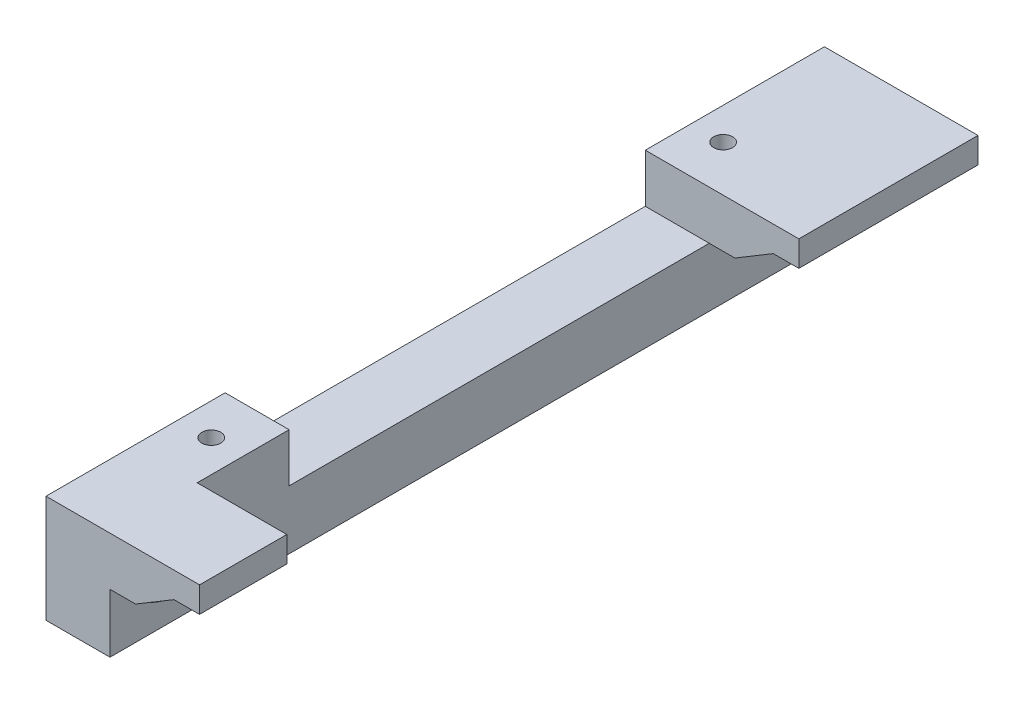
ISO-10303-21;
HEADER;
FILE_DESCRIPTION(('STEP AP214'),'2;1');
FILE_NAME('part.step','',(''),(''),'','','');
FILE_SCHEMA(('AUTOMOTIVE_DESIGN { 1 0 10303 214 1 1 1 1 }'));
ENDSEC;
DATA;
#1=APPLICATION_CONTEXT('core data for automotive mechanical design processes');
#2=APPLICATION_PROTOCOL_DEFINITION('international standard','automotive_design',2000,#1);
#3=PRODUCT_CONTEXT('',#1,'mechanical');
#4=PRODUCT('Part','Part','',(#3));
#5=PRODUCT_RELATED_PRODUCT_CATEGORY('part','',(#4));
#6=PRODUCT_DEFINITION_FORMATION('','',#4);
#7=PRODUCT_DEFINITION_CONTEXT('part definition',#1,'design');
#8=PRODUCT_DEFINITION('design','',#6,#7);
#9=PRODUCT_DEFINITION_SHAPE('','',#8);
#10=(LENGTH_UNIT() NAMED_UNIT(*) SI_UNIT(.MILLI.,.METRE.));
#11=(NAMED_UNIT(*) PLANE_ANGLE_UNIT() SI_UNIT($,.RADIAN.));
#12=(NAMED_UNIT(*) SI_UNIT($,.STERADIAN.) SOLID_ANGLE_UNIT());
#13=UNCERTAINTY_MEASURE_WITH_UNIT(LENGTH_MEASURE(1.E-05),#10,'distance_accuracy_value','');
#14=(GEOMETRIC_REPRESENTATION_CONTEXT(3) GLOBAL_UNCERTAINTY_ASSIGNED_CONTEXT((#13)) GLOBAL_UNIT_ASSIGNED_CONTEXT((#10,
#11,#12)) REPRESENTATION_CONTEXT('',''));
#15=CARTESIAN_POINT('',(0.,0.,0.));
#16=DIRECTION('',(0.,0.,1.));
#17=DIRECTION('',(1.,0.,0.));
#18=AXIS2_PLACEMENT_3D('',#15,#16,#17);
#19=CARTESIAN_POINT('',(21.37,31.,104.035));
#20=DIRECTION('',(0.,0.,1.));
#21=DIRECTION('',(-1.,0.,0.));
#22=AXIS2_PLACEMENT_3D('',#19,#20,#21);
#23=PLANE('',#22);
#24=DIRECTION('',(0.,-1.,0.));
#25=VECTOR('',#24,1.);
#26=CARTESIAN_POINT('',(3.86999999999998,31.,104.035));
#27=LINE('',#26,#25);
#28=CARTESIAN_POINT('',(3.86999999999998,31.,104.035));
#29=VERTEX_POINT('',#28);
#30=CARTESIAN_POINT('',(3.86999999999998,21.5,104.035));
#31=VERTEX_POINT('',#30);
#32=EDGE_CURVE('E183',#29,#31,#27,.T.);
#33=ORIENTED_EDGE('',*,*,#32,.T.);
#34=DIRECTION('',(-1.,0.,0.));
#35=VECTOR('',#34,1.);
#36=CARTESIAN_POINT('',(21.37,21.5,104.035));
#37=LINE('',#36,#35);
#38=CARTESIAN_POINT('',(-8.63000000000001,21.5,104.035));
#39=VERTEX_POINT('',#38);
#40=EDGE_CURVE('E192',#31,#39,#37,.T.);
#41=ORIENTED_EDGE('',*,*,#40,.T.);
#42=DIRECTION('',(0.,-1.,0.));
#43=VECTOR('',#42,1.);
#44=CARTESIAN_POINT('',(-8.63000000000001,31.,104.035));
#45=LINE('',#44,#43);
#46=CARTESIAN_POINT('',(-8.63000000000001,31.,104.035));
#47=VERTEX_POINT('',#46);
#48=EDGE_CURVE('E218',#47,#39,#45,.T.);
#49=ORIENTED_EDGE('',*,*,#48,.F.);
#50=DIRECTION('',(-1.,0.,0.));
#51=VECTOR('',#50,1.);
#52=CARTESIAN_POINT('',(21.37,31.,104.035));
#53=LINE('',#52,#51);
#54=EDGE_CURVE('E202',#29,#47,#53,.T.);
#55=ORIENTED_EDGE('',*,*,#54,.F.);
#56=EDGE_LOOP('',(#33,#41,#49,#55));
#57=FACE_BOUND('',#56,.T.);
#58=ADVANCED_FACE('F47',(#57),#23,.F.);
#59=CARTESIAN_POINT('',(21.37,10.,-13.055));
#60=DIRECTION('',(1.,0.,0.));
#61=DIRECTION('',(0.,0.,1.));
#62=AXIS2_PLACEMENT_3D('',#59,#60,#61);
#63=PLANE('',#62);
#64=DIRECTION('',(0.,1.,0.));
#65=VECTOR('',#64,1.);
#66=CARTESIAN_POINT('',(21.37,31.,121.995));
#67=LINE('',#66,#65);
#68=CARTESIAN_POINT('',(21.37,26.,121.995));
#69=VERTEX_POINT('',#68);
#70=CARTESIAN_POINT('',(21.37,31.,121.995));
#71=VERTEX_POINT('',#70);
#72=EDGE_CURVE('E204',#69,#71,#67,.T.);
#73=ORIENTED_EDGE('',*,*,#72,.T.);
#74=DIRECTION('',(0.,0.,1.));
#75=VECTOR('',#74,1.);
#76=CARTESIAN_POINT('',(21.37,31.,-13.055));
#77=LINE('',#76,#75);
#78=CARTESIAN_POINT('',(21.37,31.,139.035));
#79=VERTEX_POINT('',#78);
#80=EDGE_CURVE('E316',#71,#79,#77,.T.);
#81=ORIENTED_EDGE('',*,*,#80,.T.);
#82=DIRECTION('',(0.,-1.,0.));
#83=VECTOR('',#82,1.);
#84=CARTESIAN_POINT('',(21.37,10.,139.035));
#85=LINE('',#84,#83);
#86=CARTESIAN_POINT('',(21.37,26.,139.035));
#87=VERTEX_POINT('',#86);
#88=EDGE_CURVE('E287',#79,#87,#85,.T.);
#89=ORIENTED_EDGE('',*,*,#88,.T.);
#90=DIRECTION('',(0.,0.,1.));
#91=VECTOR('',#90,1.);
#92=CARTESIAN_POINT('',(21.37,26.,-36.7668114027588));
#93=LINE('',#92,#91);
#94=EDGE_CURVE('E271',#69,#87,#93,.T.);
#95=ORIENTED_EDGE('',*,*,#94,.F.);
#96=EDGE_LOOP('',(#73,#81,#89,#95));
#97=FACE_BOUND('',#96,.T.);
#98=ADVANCED_FACE('F339',(#97),#63,.T.);
#99=CARTESIAN_POINT('',(21.37,31.,-13.055));
#100=DIRECTION('',(0.,1.,0.));
#101=DIRECTION('',(0.,0.,1.));
#102=AXIS2_PLACEMENT_3D('',#99,#100,#101);
#103=PLANE('',#102);
#104=DIRECTION('',(1.,0.,0.));
#105=VECTOR('',#104,1.);
#106=CARTESIAN_POINT('',(3.86999999999998,31.,121.995));
#107=LINE('',#106,#105);
#108=CARTESIAN_POINT('',(3.86999999999998,31.,121.995));
#109=VERTEX_POINT('',#108);
#110=EDGE_CURVE('E212',#109,#71,#107,.T.);
#111=ORIENTED_EDGE('',*,*,#110,.F.);
#112=DIRECTION('',(0.,0.,-1.));
#113=VECTOR('',#112,1.);
#114=CARTESIAN_POINT('',(3.86999999999998,31.,104.035));
#115=LINE('',#114,#113);
#116=EDGE_CURVE('E62',#109,#29,#115,.T.);
#117=ORIENTED_EDGE('',*,*,#116,.T.);
#118=ORIENTED_EDGE('',*,*,#54,.T.);
#119=DIRECTION('',(0.,0.,1.));
#120=VECTOR('',#119,1.);
#121=CARTESIAN_POINT('',(-8.63000000000001,31.,-13.055));
#122=LINE('',#121,#120);
#123=CARTESIAN_POINT('',(-8.63000000000001,31.,139.035));
#124=VERTEX_POINT('',#123);
#125=EDGE_CURVE('E320',#47,#124,#122,.T.);
#126=ORIENTED_EDGE('',*,*,#125,.T.);
#127=DIRECTION('',(1.,0.,0.));
#128=VECTOR('',#127,1.);
#129=CARTESIAN_POINT('',(21.37,31.,139.035));
#130=LINE('',#129,#128);
#131=EDGE_CURVE('E299',#124,#79,#130,.T.);
#132=ORIENTED_EDGE('',*,*,#131,.T.);
#133=ORIENTED_EDGE('',*,*,#80,.F.);
#134=EDGE_LOOP('',(#111,#117,#118,#126,#132,#133));
#135=FACE_BOUND('',#134,.T.);
#136=CARTESIAN_POINT('',(-2.38,31.,112.99));
#137=DIRECTION('',(0.,-1.,0.));
#138=DIRECTION('',(0.,0.,1.));
#139=AXIS2_PLACEMENT_3D('',#136,#137,#138);
#140=CIRCLE('',#139,1.85);
#141=CARTESIAN_POINT('',(-2.38,31.,114.84));
#142=VERTEX_POINT('',#141);
#143=EDGE_CURVE('E236',#142,#142,#140,.T.);
#144=ORIENTED_EDGE('',*,*,#143,.T.);
#145=EDGE_LOOP('',(#144));
#146=FACE_BOUND('',#145,.T.);
#147=ADVANCED_FACE('F326',(#135,#146),#103,.T.);
#148=CARTESIAN_POINT('',(3.86999999999998,21.5,-36.7668114027588));
#149=DIRECTION('',(0.,1.,0.));
#150=DIRECTION('',(1.,0.,0.));
#151=AXIS2_PLACEMENT_3D('',#148,#149,#150);
#152=PLANE('',#151);
#153=DIRECTION('',(0.,0.,1.));
#154=VECTOR('',#153,1.);
#155=CARTESIAN_POINT('',(8.86999999999999,21.5,-36.7668114027588));
#156=LINE('',#155,#154);
#157=CARTESIAN_POINT('',(8.86999999999999,21.5,121.995));
#158=VERTEX_POINT('',#157);
#159=CARTESIAN_POINT('',(8.86999999999999,21.5,139.035));
#160=VERTEX_POINT('',#159);
#161=EDGE_CURVE('E281',#158,#160,#156,.T.);
#162=ORIENTED_EDGE('',*,*,#161,.T.);
#163=DIRECTION('',(1.,0.,0.));
#164=VECTOR('',#163,1.);
#165=CARTESIAN_POINT('',(3.86999999999998,21.5,139.035));
#166=LINE('',#165,#164);
#167=CARTESIAN_POINT('',(3.86999999999998,21.5,139.035));
#168=VERTEX_POINT('',#167);
#169=EDGE_CURVE('E265',#168,#160,#166,.T.);
#170=ORIENTED_EDGE('',*,*,#169,.F.);
#171=DIRECTION('',(0.,0.,1.));
#172=VECTOR('',#171,1.);
#173=CARTESIAN_POINT('',(3.86999999999998,21.5,-36.7668114027588));
#174=LINE('',#173,#172);
#175=CARTESIAN_POINT('',(3.86999999999998,21.5,121.995));
#176=VERTEX_POINT('',#175);
#177=EDGE_CURVE('E284',#176,#168,#174,.T.);
#178=ORIENTED_EDGE('',*,*,#177,.F.);
#179=DIRECTION('',(1.,0.,0.));
#180=VECTOR('',#179,1.);
#181=CARTESIAN_POINT('',(3.86999999999998,21.5,121.995));
#182=LINE('',#181,#180);
#183=EDGE_CURVE('E210',#176,#158,#182,.T.);
#184=ORIENTED_EDGE('',*,*,#183,.T.);
#185=EDGE_LOOP('',(#162,#170,#178,#184));
#186=FACE_BOUND('',#185,.T.);
#187=ADVANCED_FACE('F350',(#186),#152,.F.);
#188=CARTESIAN_POINT('',(8.86999999999999,21.5,-36.7668114027588));
#189=DIRECTION('',(-0.514495755427527,0.857492925712544,0.));
#190=DIRECTION('',(0.857492925712544,0.514495755427527,0.));
#191=AXIS2_PLACEMENT_3D('',#188,#189,#190);
#192=PLANE('',#191);
#193=DIRECTION('',(0.,0.,1.));
#194=VECTOR('',#193,1.);
#195=CARTESIAN_POINT('',(16.37,26.,-36.7668114027588));
#196=LINE('',#195,#194);
#197=CARTESIAN_POINT('',(16.37,26.,121.995));
#198=VERTEX_POINT('',#197);
#199=CARTESIAN_POINT('',(16.37,26.,139.035));
#200=VERTEX_POINT('',#199);
#201=EDGE_CURVE('E276',#198,#200,#196,.T.);
#202=ORIENTED_EDGE('',*,*,#201,.T.);
#203=DIRECTION('',(0.857492925712544,0.514495755427527,0.));
#204=VECTOR('',#203,1.);
#205=CARTESIAN_POINT('',(8.86999999999999,21.5,139.035));
#206=LINE('',#205,#204);
#207=EDGE_CURVE('E262',#160,#200,#206,.T.);
#208=ORIENTED_EDGE('',*,*,#207,.F.);
#209=ORIENTED_EDGE('',*,*,#161,.F.);
#210=DIRECTION('',(-0.857492925712544,-0.514495755427527,0.));
#211=VECTOR('',#210,1.);
#212=CARTESIAN_POINT('',(8.86999999999999,21.5,121.995));
#213=LINE('',#212,#211);
#214=EDGE_CURVE('E214',#198,#158,#213,.T.);
#215=ORIENTED_EDGE('',*,*,#214,.F.);
#216=EDGE_LOOP('',(#202,#208,#209,#215));
#217=FACE_BOUND('',#216,.T.);
#218=ADVANCED_FACE('F382',(#217),#192,.F.);
#219=CARTESIAN_POINT('',(16.37,26.,-36.7668114027588));
#220=DIRECTION('',(0.,1.,0.));
#221=DIRECTION('',(0.,0.,1.));
#222=AXIS2_PLACEMENT_3D('',#219,#220,#221);
#223=PLANE('',#222);
#224=ORIENTED_EDGE('',*,*,#94,.T.);
#225=DIRECTION('',(1.,0.,0.));
#226=VECTOR('',#225,1.);
#227=CARTESIAN_POINT('',(16.37,26.,139.035));
#228=LINE('',#227,#226);
#229=EDGE_CURVE('E259',#200,#87,#228,.T.);
#230=ORIENTED_EDGE('',*,*,#229,.F.);
#231=ORIENTED_EDGE('',*,*,#201,.F.);
#232=DIRECTION('',(-1.,0.,0.));
#233=VECTOR('',#232,1.);
#234=CARTESIAN_POINT('',(16.37,26.,121.995));
#235=LINE('',#234,#233);
#236=EDGE_CURVE('E12',#69,#198,#235,.T.);
#237=ORIENTED_EDGE('',*,*,#236,.F.);
#238=EDGE_LOOP('',(#224,#230,#231,#237));
#239=FACE_BOUND('',#238,.T.);
#240=ADVANCED_FACE('F389',(#239),#223,.F.);
#241=CARTESIAN_POINT('',(3.86999999999999,10.,-36.7668114027588));
#242=DIRECTION('',(-1.,0.,0.));
#243=DIRECTION('',(0.,1.,0.));
#244=AXIS2_PLACEMENT_3D('',#241,#242,#243);
#245=PLANE('',#244);
#246=DIRECTION('',(0.,0.,1.));
#247=VECTOR('',#246,1.);
#248=CARTESIAN_POINT('',(3.86999999999999,10.,-36.7668114027588));
#249=LINE('',#248,#247);
#250=CARTESIAN_POINT('',(3.86999999999999,10.,-13.055));
#251=VERTEX_POINT('',#250);
#252=CARTESIAN_POINT('',(3.86999999999999,10.,139.035));
#253=VERTEX_POINT('',#252);
#254=EDGE_CURVE('E261',#251,#253,#249,.T.);
#255=ORIENTED_EDGE('',*,*,#254,.F.);
#256=DIRECTION('',(0.,1.,0.));
#257=VECTOR('',#256,1.);
#258=CARTESIAN_POINT('',(3.86999999999999,10.,-13.055));
#259=LINE('',#258,#257);
#260=CARTESIAN_POINT('',(3.86999999999998,21.5,-13.055));
#261=VERTEX_POINT('',#260);
#262=EDGE_CURVE('E282',#251,#261,#259,.T.);
#263=ORIENTED_EDGE('',*,*,#262,.T.);
#264=CARTESIAN_POINT('',(3.86999999999998,21.5,21.945));
#265=VERTEX_POINT('',#264);
#266=EDGE_CURVE('E186',#261,#265,#174,.T.);
#267=ORIENTED_EDGE('',*,*,#266,.T.);
#268=DIRECTION('',(0.,0.,-1.));
#269=VECTOR('',#268,1.);
#270=CARTESIAN_POINT('',(3.86999999999998,21.5,-36.7668114027588));
#271=LINE('',#270,#269);
#272=EDGE_CURVE('E177',#31,#265,#271,.T.);
#273=ORIENTED_EDGE('',*,*,#272,.F.);
#274=ORIENTED_EDGE('',*,*,#32,.F.);
#275=ORIENTED_EDGE('',*,*,#116,.F.);
#276=DIRECTION('',(0.,1.,0.));
#277=VECTOR('',#276,1.);
#278=CARTESIAN_POINT('',(3.86999999999998,31.,121.995));
#279=LINE('',#278,#277);
#280=EDGE_CURVE('E203',#176,#109,#279,.T.);
#281=ORIENTED_EDGE('',*,*,#280,.F.);
#282=ORIENTED_EDGE('',*,*,#177,.T.);
#283=DIRECTION('',(0.,1.,0.));
#284=VECTOR('',#283,1.);
#285=CARTESIAN_POINT('',(3.86999999999999,10.,139.035));
#286=LINE('',#285,#284);
#287=EDGE_CURVE('E256',#253,#168,#286,.T.);
#288=ORIENTED_EDGE('',*,*,#287,.F.);
#289=EDGE_LOOP('',(#255,#263,#267,#273,#274,#275,#281,#282,#288));
#290=FACE_BOUND('',#289,.T.);
#291=DIRECTION('',(0.,0.,1.));
#292=VECTOR('',#291,1.);
#293=CARTESIAN_POINT('',(3.86999999999999,15.5,7.817281323269));
#294=LINE('',#293,#292);
#295=CARTESIAN_POINT('',(3.86999999999999,15.5,2.07271867673098));
#296=VERTEX_POINT('',#295);
#297=CARTESIAN_POINT('',(3.86999999999999,15.5,7.817281323269));
#298=VERTEX_POINT('',#297);
#299=EDGE_CURVE('E245',#296,#298,#294,.T.);
#300=ORIENTED_EDGE('',*,*,#299,.T.);
#301=DIRECTION('',(0.,1.,0.));
#302=VECTOR('',#301,1.);
#303=CARTESIAN_POINT('',(3.86999999999999,15.5,7.817281323269));
#304=LINE('',#303,#302);
#305=CARTESIAN_POINT('',(3.86999999999998,19.,7.81728132326899));
#306=VERTEX_POINT('',#305);
#307=EDGE_CURVE('E253',#298,#306,#304,.T.);
#308=ORIENTED_EDGE('',*,*,#307,.T.);
#309=DIRECTION('',(0.,0.,1.));
#310=VECTOR('',#309,1.);
#311=CARTESIAN_POINT('',(3.86999999999999,19.,7.817281323269));
#312=LINE('',#311,#310);
#313=CARTESIAN_POINT('',(3.86999999999999,19.,2.07271867673098));
#314=VERTEX_POINT('',#313);
#315=EDGE_CURVE('E246',#314,#306,#312,.T.);
#316=ORIENTED_EDGE('',*,*,#315,.F.);
#317=DIRECTION('',(0.,1.,0.));
#318=VECTOR('',#317,1.);
#319=CARTESIAN_POINT('',(3.86999999999999,15.5,2.07271867673098));
#320=LINE('',#319,#318);
#321=EDGE_CURVE('E249',#296,#314,#320,.T.);
#322=ORIENTED_EDGE('',*,*,#321,.F.);
#323=EDGE_LOOP('',(#300,#308,#316,#322));
#324=FACE_BOUND('',#323,.T.);
#325=ADVANCED_FACE('F180',(#290,#324),#245,.F.);
#326=DIRECTION('',(0.,1.,0.));
#327=VECTOR('',#326,1.);
#328=CARTESIAN_POINT('',(21.37,31.,21.945));
#329=LINE('',#328,#327);
#330=CARTESIAN_POINT('',(21.37,26.,21.945));
#331=VERTEX_POINT('',#330);
#332=CARTESIAN_POINT('',(21.37,31.,21.945));
#333=VERTEX_POINT('',#332);
#334=EDGE_CURVE('E200',#331,#333,#329,.T.);
#335=ORIENTED_EDGE('',*,*,#334,.F.);
#336=CARTESIAN_POINT('',(21.37,26.,-13.055));
#337=VERTEX_POINT('',#336);
#338=EDGE_CURVE('E285',#337,#331,#93,.T.);
#339=ORIENTED_EDGE('',*,*,#338,.F.);
#340=DIRECTION('',(0.,-1.,0.));
#341=VECTOR('',#340,1.);
#342=CARTESIAN_POINT('',(21.37,10.,-13.055));
#343=LINE('',#342,#341);
#344=CARTESIAN_POINT('',(21.37,31.,-13.055));
#345=VERTEX_POINT('',#344);
#346=EDGE_CURVE('E295',#345,#337,#343,.T.);
#347=ORIENTED_EDGE('',*,*,#346,.F.);
#348=EDGE_CURVE('E313',#345,#333,#77,.T.);
#349=ORIENTED_EDGE('',*,*,#348,.T.);
#350=EDGE_LOOP('',(#335,#339,#347,#349));
#351=FACE_BOUND('',#350,.T.);
#352=ADVANCED_FACE('F49',(#351),#63,.T.);
#353=DIRECTION('',(-1.,0.,0.));
#354=VECTOR('',#353,1.);
#355=CARTESIAN_POINT('',(21.37,31.,21.945));
#356=LINE('',#355,#354);
#357=CARTESIAN_POINT('',(-8.63000000000001,31.,21.945));
#358=VERTEX_POINT('',#357);
#359=EDGE_CURVE('E225',#333,#358,#356,.T.);
#360=ORIENTED_EDGE('',*,*,#359,.F.);
#361=ORIENTED_EDGE('',*,*,#348,.F.);
#362=DIRECTION('',(1.,0.,0.));
#363=VECTOR('',#362,1.);
#364=CARTESIAN_POINT('',(21.37,31.,-13.055));
#365=LINE('',#364,#363);
#366=CARTESIAN_POINT('',(-8.63000000000001,31.,-13.055));
#367=VERTEX_POINT('',#366);
#368=EDGE_CURVE('E303',#367,#345,#365,.T.);
#369=ORIENTED_EDGE('',*,*,#368,.F.);
#370=EDGE_CURVE('E317',#367,#358,#122,.T.);
#371=ORIENTED_EDGE('',*,*,#370,.T.);
#372=EDGE_LOOP('',(#360,#361,#369,#371));
#373=FACE_BOUND('',#372,.T.);
#374=CARTESIAN_POINT('',(-2.38,31.,12.99));
#375=DIRECTION('',(0.,-1.,0.));
#376=DIRECTION('',(0.,0.,1.));
#377=AXIS2_PLACEMENT_3D('',#374,#375,#376);
#378=CIRCLE('',#377,1.85);
#379=CARTESIAN_POINT('',(-2.38,31.,14.84));
#380=VERTEX_POINT('',#379);
#381=EDGE_CURVE('E188',#380,#380,#378,.T.);
#382=ORIENTED_EDGE('',*,*,#381,.T.);
#383=EDGE_LOOP('',(#382));
#384=FACE_BOUND('',#383,.T.);
#385=ADVANCED_FACE('F369',(#373,#384),#103,.T.);
#386=CARTESIAN_POINT('',(-8.63000000000001,10.,-13.055));
#387=DIRECTION('',(-1.,0.,0.));
#388=DIRECTION('',(0.,0.,-1.));
#389=AXIS2_PLACEMENT_3D('',#386,#387,#388);
#390=PLANE('',#389);
#391=ORIENTED_EDGE('',*,*,#48,.T.);
#392=DIRECTION('',(0.,0.,-1.));
#393=VECTOR('',#392,1.);
#394=CARTESIAN_POINT('',(-8.63000000000001,21.5,104.035));
#395=LINE('',#394,#393);
#396=CARTESIAN_POINT('',(-8.63000000000001,21.5,21.945));
#397=VERTEX_POINT('',#396);
#398=EDGE_CURVE('E195',#39,#397,#395,.T.);
#399=ORIENTED_EDGE('',*,*,#398,.T.);
#400=DIRECTION('',(0.,1.,0.));
#401=VECTOR('',#400,1.);
#402=CARTESIAN_POINT('',(-8.63000000000001,31.,21.945));
#403=LINE('',#402,#401);
#404=EDGE_CURVE('E220',#397,#358,#403,.T.);
#405=ORIENTED_EDGE('',*,*,#404,.T.);
#406=ORIENTED_EDGE('',*,*,#370,.F.);
#407=DIRECTION('',(0.,1.,0.));
#408=VECTOR('',#407,1.);
#409=CARTESIAN_POINT('',(-8.63000000000001,10.,-13.055));
#410=LINE('',#409,#408);
#411=CARTESIAN_POINT('',(-8.63000000000001,10.,-13.055));
#412=VERTEX_POINT('',#411);
#413=EDGE_CURVE('E301',#412,#367,#410,.T.);
#414=ORIENTED_EDGE('',*,*,#413,.F.);
#415=DIRECTION('',(0.,0.,1.));
#416=VECTOR('',#415,1.);
#417=CARTESIAN_POINT('',(-8.63000000000001,10.,-13.055));
#418=LINE('',#417,#416);
#419=CARTESIAN_POINT('',(-8.63000000000001,10.,139.035));
#420=VERTEX_POINT('',#419);
#421=EDGE_CURVE('E305',#412,#420,#418,.T.);
#422=ORIENTED_EDGE('',*,*,#421,.T.);
#423=DIRECTION('',(0.,1.,0.));
#424=VECTOR('',#423,1.);
#425=CARTESIAN_POINT('',(-8.63000000000001,10.,139.035));
#426=LINE('',#425,#424);
#427=EDGE_CURVE('E310',#420,#124,#426,.T.);
#428=ORIENTED_EDGE('',*,*,#427,.T.);
#429=ORIENTED_EDGE('',*,*,#125,.F.);
#430=EDGE_LOOP('',(#391,#399,#405,#406,#414,#422,#428,#429));
#431=FACE_BOUND('',#430,.T.);
#432=ADVANCED_FACE('F331',(#431),#390,.T.);
#433=CARTESIAN_POINT('',(21.37,10.,-13.055));
#434=DIRECTION('',(0.,-1.,0.));
#435=DIRECTION('',(0.,0.,-1.));
#436=AXIS2_PLACEMENT_3D('',#433,#434,#435);
#437=PLANE('',#436);
#438=CARTESIAN_POINT('',(-2.38,10.,12.99));
#439=DIRECTION('',(0.,1.,0.));
#440=DIRECTION('',(0.,0.,-1.));
#441=AXIS2_PLACEMENT_3D('',#438,#439,#440);
#442=CIRCLE('',#441,1.85);
#443=CARTESIAN_POINT('',(-2.38,10.,11.14));
#444=VERTEX_POINT('',#443);
#445=EDGE_CURVE('E233',#444,#444,#442,.T.);
#446=ORIENTED_EDGE('',*,*,#445,.T.);
#447=EDGE_LOOP('',(#446));
#448=FACE_BOUND('',#447,.T.);
#449=CARTESIAN_POINT('',(-2.38,10.,112.99));
#450=DIRECTION('',(0.,1.,0.));
#451=DIRECTION('',(0.,0.,-1.));
#452=AXIS2_PLACEMENT_3D('',#449,#450,#451);
#453=CIRCLE('',#452,1.85);
#454=CARTESIAN_POINT('',(-2.38,10.,111.14));
#455=VERTEX_POINT('',#454);
#456=EDGE_CURVE('E239',#455,#455,#453,.T.);
#457=ORIENTED_EDGE('',*,*,#456,.T.);
#458=EDGE_LOOP('',(#457));
#459=FACE_BOUND('',#458,.T.);
#460=ORIENTED_EDGE('',*,*,#254,.T.);
#461=DIRECTION('',(-1.,0.,0.));
#462=VECTOR('',#461,1.);
#463=CARTESIAN_POINT('',(21.37,10.,139.035));
#464=LINE('',#463,#462);
#465=EDGE_CURVE('E308',#253,#420,#464,.T.);
#466=ORIENTED_EDGE('',*,*,#465,.T.);
#467=ORIENTED_EDGE('',*,*,#421,.F.);
#468=DIRECTION('',(-1.,0.,0.));
#469=VECTOR('',#468,1.);
#470=CARTESIAN_POINT('',(21.37,10.,-13.055));
#471=LINE('',#470,#469);
#472=EDGE_CURVE('E298',#251,#412,#471,.T.);
#473=ORIENTED_EDGE('',*,*,#472,.F.);
#474=EDGE_LOOP('',(#460,#466,#467,#473));
#475=FACE_BOUND('',#474,.T.);
#476=ADVANCED_FACE('F354',(#448,#459,#475),#437,.T.);
#477=CARTESIAN_POINT('',(-17.26,0.,-13.055));
#478=DIRECTION('',(0.,0.,-1.));
#479=DIRECTION('',(1.,0.,0.));
#480=AXIS2_PLACEMENT_3D('',#477,#478,#479);
#481=PLANE('',#480);
#482=ORIENTED_EDGE('',*,*,#262,.F.);
#483=ORIENTED_EDGE('',*,*,#472,.T.);
#484=ORIENTED_EDGE('',*,*,#413,.T.);
#485=ORIENTED_EDGE('',*,*,#368,.T.);
#486=ORIENTED_EDGE('',*,*,#346,.T.);
#487=DIRECTION('',(1.,0.,0.));
#488=VECTOR('',#487,1.);
#489=CARTESIAN_POINT('',(16.37,26.,-13.055));
#490=LINE('',#489,#488);
#491=CARTESIAN_POINT('',(16.37,26.,-13.055));
#492=VERTEX_POINT('',#491);
#493=EDGE_CURVE('E269',#492,#337,#490,.T.);
#494=ORIENTED_EDGE('',*,*,#493,.F.);
#495=DIRECTION('',(0.857492925712544,0.514495755427527,0.));
#496=VECTOR('',#495,1.);
#497=CARTESIAN_POINT('',(8.86999999999999,21.5,-13.055));
#498=LINE('',#497,#496);
#499=CARTESIAN_POINT('',(8.86999999999999,21.5,-13.055));
#500=VERTEX_POINT('',#499);
#501=EDGE_CURVE('E273',#500,#492,#498,.T.);
#502=ORIENTED_EDGE('',*,*,#501,.F.);
#503=DIRECTION('',(1.,0.,0.));
#504=VECTOR('',#503,1.);
#505=CARTESIAN_POINT('',(3.86999999999998,21.5,-13.055));
#506=LINE('',#505,#504);
#507=EDGE_CURVE('E278',#261,#500,#506,.T.);
#508=ORIENTED_EDGE('',*,*,#507,.F.);
#509=EDGE_LOOP('',(#482,#483,#484,#485,#486,#494,#502,#508));
#510=FACE_BOUND('',#509,.T.);
#511=ADVANCED_FACE('F357',(#510),#481,.T.);
#512=CARTESIAN_POINT('',(-17.26,0.,139.035));
#513=DIRECTION('',(0.,0.,-1.));
#514=DIRECTION('',(1.,0.,0.));
#515=AXIS2_PLACEMENT_3D('',#512,#513,#514);
#516=PLANE('',#515);
#517=ORIENTED_EDGE('',*,*,#169,.T.);
#518=ORIENTED_EDGE('',*,*,#207,.T.);
#519=ORIENTED_EDGE('',*,*,#229,.T.);
#520=ORIENTED_EDGE('',*,*,#88,.F.);
#521=ORIENTED_EDGE('',*,*,#131,.F.);
#522=ORIENTED_EDGE('',*,*,#427,.F.);
#523=ORIENTED_EDGE('',*,*,#465,.F.);
#524=ORIENTED_EDGE('',*,*,#287,.T.);
#525=EDGE_LOOP('',(#517,#518,#519,#520,#521,#522,#523,#524));
#526=FACE_BOUND('',#525,.T.);
#527=ADVANCED_FACE('F334',(#526),#516,.F.);
#528=ORIENTED_EDGE('',*,*,#266,.F.);
#529=ORIENTED_EDGE('',*,*,#507,.T.);
#530=CARTESIAN_POINT('',(8.86999999999999,21.5,21.945));
#531=VERTEX_POINT('',#530);
#532=EDGE_CURVE('E277',#500,#531,#156,.T.);
#533=ORIENTED_EDGE('',*,*,#532,.T.);
#534=DIRECTION('',(-1.,0.,0.));
#535=VECTOR('',#534,1.);
#536=CARTESIAN_POINT('',(21.37,21.5,21.945));
#537=LINE('',#536,#535);
#538=EDGE_CURVE('E228',#531,#265,#537,.T.);
#539=ORIENTED_EDGE('',*,*,#538,.T.);
#540=EDGE_LOOP('',(#528,#529,#533,#539));
#541=FACE_BOUND('',#540,.T.);
#542=ADVANCED_FACE('F362',(#541),#152,.F.);
#543=ORIENTED_EDGE('',*,*,#532,.F.);
#544=ORIENTED_EDGE('',*,*,#501,.T.);
#545=CARTESIAN_POINT('',(16.37,26.,21.945));
#546=VERTEX_POINT('',#545);
#547=EDGE_CURVE('E272',#492,#546,#196,.T.);
#548=ORIENTED_EDGE('',*,*,#547,.T.);
#549=DIRECTION('',(0.857492925712544,0.514495755427527,0.));
#550=VECTOR('',#549,1.);
#551=CARTESIAN_POINT('',(8.86999999999999,21.5,21.945));
#552=LINE('',#551,#550);
#553=EDGE_CURVE('E189',#531,#546,#552,.T.);
#554=ORIENTED_EDGE('',*,*,#553,.F.);
#555=EDGE_LOOP('',(#543,#544,#548,#554));
#556=FACE_BOUND('',#555,.T.);
#557=ADVANCED_FACE('F379',(#556),#192,.F.);
#558=ORIENTED_EDGE('',*,*,#547,.F.);
#559=ORIENTED_EDGE('',*,*,#493,.T.);
#560=ORIENTED_EDGE('',*,*,#338,.T.);
#561=DIRECTION('',(1.,0.,0.));
#562=VECTOR('',#561,1.);
#563=CARTESIAN_POINT('',(16.37,26.,21.945));
#564=LINE('',#563,#562);
#565=EDGE_CURVE('E55',#546,#331,#564,.T.);
#566=ORIENTED_EDGE('',*,*,#565,.F.);
#567=EDGE_LOOP('',(#558,#559,#560,#566));
#568=FACE_BOUND('',#567,.T.);
#569=ADVANCED_FACE('F377',(#568),#223,.F.);
#570=CARTESIAN_POINT('',(5.87,15.5,4.94499999999999));
#571=DIRECTION('',(0.,1.,0.));
#572=DIRECTION('',(0.,0.,1.));
#573=AXIS2_PLACEMENT_3D('',#570,#571,#572);
#574=CYLINDRICAL_SURFACE('',#573,3.5);
#575=CARTESIAN_POINT('',(5.87,19.,4.94499999999999));
#576=DIRECTION('',(0.,-1.,0.));
#577=DIRECTION('',(0.,0.,1.));
#578=AXIS2_PLACEMENT_3D('',#575,#576,#577);
#579=CIRCLE('',#578,3.5);
#580=EDGE_CURVE('E242',#306,#314,#579,.T.);
#581=ORIENTED_EDGE('',*,*,#580,.F.);
#582=ORIENTED_EDGE('',*,*,#307,.F.);
#583=CARTESIAN_POINT('',(5.87,15.5,4.94499999999999));
#584=DIRECTION('',(0.,-1.,0.));
#585=DIRECTION('',(0.,0.,1.));
#586=AXIS2_PLACEMENT_3D('',#583,#584,#585);
#587=CIRCLE('',#586,3.5);
#588=EDGE_CURVE('E243',#298,#296,#587,.T.);
#589=ORIENTED_EDGE('',*,*,#588,.T.);
#590=ORIENTED_EDGE('',*,*,#321,.T.);
#591=EDGE_LOOP('',(#581,#582,#589,#590));
#592=FACE_BOUND('',#591,.T.);
#593=ADVANCED_FACE('F387',(#592),#574,.F.);
#594=CARTESIAN_POINT('',(5.87,15.5,4.94499999999999));
#595=DIRECTION('',(0.,1.,0.));
#596=DIRECTION('',(0.,0.,1.));
#597=AXIS2_PLACEMENT_3D('',#594,#595,#596);
#598=PLANE('',#597);
#599=ORIENTED_EDGE('',*,*,#588,.F.);
#600=ORIENTED_EDGE('',*,*,#299,.F.);
#601=EDGE_LOOP('',(#599,#600));
#602=FACE_BOUND('',#601,.T.);
#603=ADVANCED_FACE('F410',(#602),#598,.T.);
#604=CARTESIAN_POINT('',(5.87,19.,4.94499999999999));
#605=DIRECTION('',(0.,1.,0.));
#606=DIRECTION('',(0.,0.,1.));
#607=AXIS2_PLACEMENT_3D('',#604,#605,#606);
#608=PLANE('',#607);
#609=ORIENTED_EDGE('',*,*,#580,.T.);
#610=ORIENTED_EDGE('',*,*,#315,.T.);
#611=EDGE_LOOP('',(#609,#610));
#612=FACE_BOUND('',#611,.T.);
#613=ADVANCED_FACE('F408',(#612),#608,.F.);
#614=CARTESIAN_POINT('',(-2.38,31.,112.99));
#615=DIRECTION('',(0.,1.,0.));
#616=DIRECTION('',(0.,0.,1.));
#617=AXIS2_PLACEMENT_3D('',#614,#615,#616);
#618=CYLINDRICAL_SURFACE('',#617,1.85);
#619=ORIENTED_EDGE('',*,*,#143,.F.);
#620=EDGE_LOOP('',(#619));
#621=FACE_BOUND('',#620,.T.);
#622=ORIENTED_EDGE('',*,*,#456,.F.);
#623=EDGE_LOOP('',(#622));
#624=FACE_BOUND('',#623,.T.);
#625=ADVANCED_FACE('F404',(#621,#624),#618,.F.);
#626=CARTESIAN_POINT('',(-2.38,31.,12.99));
#627=DIRECTION('',(0.,1.,0.));
#628=DIRECTION('',(0.,0.,1.));
#629=AXIS2_PLACEMENT_3D('',#626,#627,#628);
#630=CYLINDRICAL_SURFACE('',#629,1.85);
#631=ORIENTED_EDGE('',*,*,#381,.F.);
#632=EDGE_LOOP('',(#631));
#633=FACE_BOUND('',#632,.T.);
#634=ORIENTED_EDGE('',*,*,#445,.F.);
#635=EDGE_LOOP('',(#634));
#636=FACE_BOUND('',#635,.T.);
#637=ADVANCED_FACE('F401',(#633,#636),#630,.F.);
#638=CARTESIAN_POINT('',(21.37,21.5,104.035));
#639=DIRECTION('',(0.,-1.,0.));
#640=DIRECTION('',(0.,0.,-1.));
#641=AXIS2_PLACEMENT_3D('',#638,#639,#640);
#642=PLANE('',#641);
#643=ORIENTED_EDGE('',*,*,#40,.F.);
#644=ORIENTED_EDGE('',*,*,#272,.T.);
#645=EDGE_CURVE('E199',#265,#397,#537,.T.);
#646=ORIENTED_EDGE('',*,*,#645,.T.);
#647=ORIENTED_EDGE('',*,*,#398,.F.);
#648=EDGE_LOOP('',(#643,#644,#646,#647));
#649=FACE_BOUND('',#648,.T.);
#650=ADVANCED_FACE('F193',(#649),#642,.F.);
#651=CARTESIAN_POINT('',(21.37,31.,21.945));
#652=DIRECTION('',(0.,0.,-1.));
#653=DIRECTION('',(1.,0.,0.));
#654=AXIS2_PLACEMENT_3D('',#651,#652,#653);
#655=PLANE('',#654);
#656=ORIENTED_EDGE('',*,*,#538,.F.);
#657=ORIENTED_EDGE('',*,*,#553,.T.);
#658=ORIENTED_EDGE('',*,*,#565,.T.);
#659=ORIENTED_EDGE('',*,*,#334,.T.);
#660=ORIENTED_EDGE('',*,*,#359,.T.);
#661=ORIENTED_EDGE('',*,*,#404,.F.);
#662=ORIENTED_EDGE('',*,*,#645,.F.);
#663=EDGE_LOOP('',(#656,#657,#658,#659,#660,#661,#662));
#664=FACE_BOUND('',#663,.T.);
#665=ADVANCED_FACE('F364',(#664),#655,.F.);
#666=CARTESIAN_POINT('',(3.86999999999998,31.,121.995));
#667=DIRECTION('',(0.,0.,1.));
#668=DIRECTION('',(-1.,0.,0.));
#669=AXIS2_PLACEMENT_3D('',#666,#667,#668);
#670=PLANE('',#669);
#671=ORIENTED_EDGE('',*,*,#236,.T.);
#672=ORIENTED_EDGE('',*,*,#214,.T.);
#673=ORIENTED_EDGE('',*,*,#183,.F.);
#674=ORIENTED_EDGE('',*,*,#280,.T.);
#675=ORIENTED_EDGE('',*,*,#110,.T.);
#676=ORIENTED_EDGE('',*,*,#72,.F.);
#677=EDGE_LOOP('',(#671,#672,#673,#674,#675,#676));
#678=FACE_BOUND('',#677,.T.);
#679=ADVANCED_FACE('F342',(#678),#670,.F.);
#680=CLOSED_SHELL('',(#58,#98,#147,#187,#218,#240,#325,#352,#385,#432,#476,#511,#527,#542,#557,
#569,#593,#603,#613,#625,#637,#650,#665,#679));
#681=MANIFOLD_SOLID_BREP('B2',#680);
#682=CARTESIAN_POINT('',(1.86999999999999,18.75,129.035));
#683=DIRECTION('',(0.,-1.,0.));
#684=DIRECTION('',(0.,0.,-1.));
#685=AXIS2_PLACEMENT_3D('',#682,#683,#684);
#686=CYLINDRICAL_SURFACE('',#685,3.50000000000001);
#687=CARTESIAN_POINT('',(1.86999999999999,15.75,129.035));
#688=DIRECTION('',(0.,-1.,0.));
#689=DIRECTION('',(0.,0.,-1.));
#690=AXIS2_PLACEMENT_3D('',#687,#688,#689);
#691=CIRCLE('',#690,3.50000000000001);
#692=CARTESIAN_POINT('',(3.86999999999999,15.75,126.162718676731));
#693=VERTEX_POINT('',#692);
#694=CARTESIAN_POINT('',(3.86999999999999,15.75,131.907281323269));
#695=VERTEX_POINT('',#694);
#696=EDGE_CURVE('E626',#693,#695,#691,.T.);
#697=ORIENTED_EDGE('',*,*,#696,.F.);
#698=DIRECTION('',(0.,-1.,0.));
#699=VECTOR('',#698,1.);
#700=CARTESIAN_POINT('',(3.86999999999999,18.75,126.162718676731));
#701=LINE('',#700,#699);
#702=CARTESIAN_POINT('',(3.86999999999999,18.75,126.162718676731));
#703=VERTEX_POINT('',#702);
#704=EDGE_CURVE('E607',#703,#693,#701,.T.);
#705=ORIENTED_EDGE('',*,*,#704,.F.);
#706=CARTESIAN_POINT('',(1.86999999999999,18.75,129.035));
#707=DIRECTION('',(0.,-1.,0.));
#708=DIRECTION('',(0.,0.,-1.));
#709=AXIS2_PLACEMENT_3D('',#706,#707,#708);
#710=CIRCLE('',#709,3.50000000000001);
#711=CARTESIAN_POINT('',(3.86999999999999,18.75,131.907281323269));
#712=VERTEX_POINT('',#711);
#713=EDGE_CURVE('E627',#703,#712,#710,.T.);
#714=ORIENTED_EDGE('',*,*,#713,.T.);
#715=DIRECTION('',(0.,-1.,0.));
#716=VECTOR('',#715,1.);
#717=CARTESIAN_POINT('',(3.86999999999999,18.75,131.907281323269));
#718=LINE('',#717,#716);
#719=EDGE_CURVE('E45',#712,#695,#718,.T.);
#720=ORIENTED_EDGE('',*,*,#719,.T.);
#721=EDGE_LOOP('',(#697,#705,#714,#720));
#722=FACE_BOUND('',#721,.T.);
#723=ADVANCED_FACE('F599',(#722),#686,.T.);
#724=CARTESIAN_POINT('',(3.86999999999999,18.75,131.907281323269));
#725=DIRECTION('',(1.,0.,0.));
#726=DIRECTION('',(0.,0.,1.));
#727=AXIS2_PLACEMENT_3D('',#724,#725,#726);
#728=PLANE('',#727);
#729=DIRECTION('',(0.,0.,-1.));
#730=VECTOR('',#729,1.);
#731=CARTESIAN_POINT('',(3.86999999999999,15.75,131.907281323269));
#732=LINE('',#731,#730);
#733=EDGE_CURVE('E621',#695,#693,#732,.T.);
#734=ORIENTED_EDGE('',*,*,#733,.F.);
#735=ORIENTED_EDGE('',*,*,#719,.F.);
#736=DIRECTION('',(0.,0.,-1.));
#737=VECTOR('',#736,1.);
#738=CARTESIAN_POINT('',(3.86999999999999,18.75,131.907281323269));
#739=LINE('',#738,#737);
#740=EDGE_CURVE('E615',#712,#703,#739,.T.);
#741=ORIENTED_EDGE('',*,*,#740,.T.);
#742=ORIENTED_EDGE('',*,*,#704,.T.);
#743=EDGE_LOOP('',(#734,#735,#741,#742));
#744=FACE_BOUND('',#743,.T.);
#745=ADVANCED_FACE('F630',(#744),#728,.F.);
#746=CARTESIAN_POINT('',(1.86999999999999,18.75,129.035));
#747=DIRECTION('',(0.,-1.,0.));
#748=DIRECTION('',(0.,0.,-1.));
#749=AXIS2_PLACEMENT_3D('',#746,#747,#748);
#750=PLANE('',#749);
#751=ORIENTED_EDGE('',*,*,#713,.F.);
#752=ORIENTED_EDGE('',*,*,#740,.F.);
#753=EDGE_LOOP('',(#751,#752));
#754=FACE_BOUND('',#753,.T.);
#755=ADVANCED_FACE('F637',(#754),#750,.F.);
#756=CARTESIAN_POINT('',(1.86999999999999,15.75,129.035));
#757=DIRECTION('',(0.,-1.,0.));
#758=DIRECTION('',(0.,0.,-1.));
#759=AXIS2_PLACEMENT_3D('',#756,#757,#758);
#760=PLANE('',#759);
#761=ORIENTED_EDGE('',*,*,#696,.T.);
#762=ORIENTED_EDGE('',*,*,#733,.T.);
#763=EDGE_LOOP('',(#761,#762));
#764=FACE_BOUND('',#763,.T.);
#765=ADVANCED_FACE('F624',(#764),#760,.T.);
#766=CLOSED_SHELL('',(#723,#745,#755,#765));
#767=MANIFOLD_SOLID_BREP('B6',#766);
#768=ADVANCED_BREP_SHAPE_REPRESENTATION('',(#18,#681,#767),#14);
#769=SHAPE_DEFINITION_REPRESENTATION(#9,#768);
ENDSEC;
END-ISO-10303-21;
